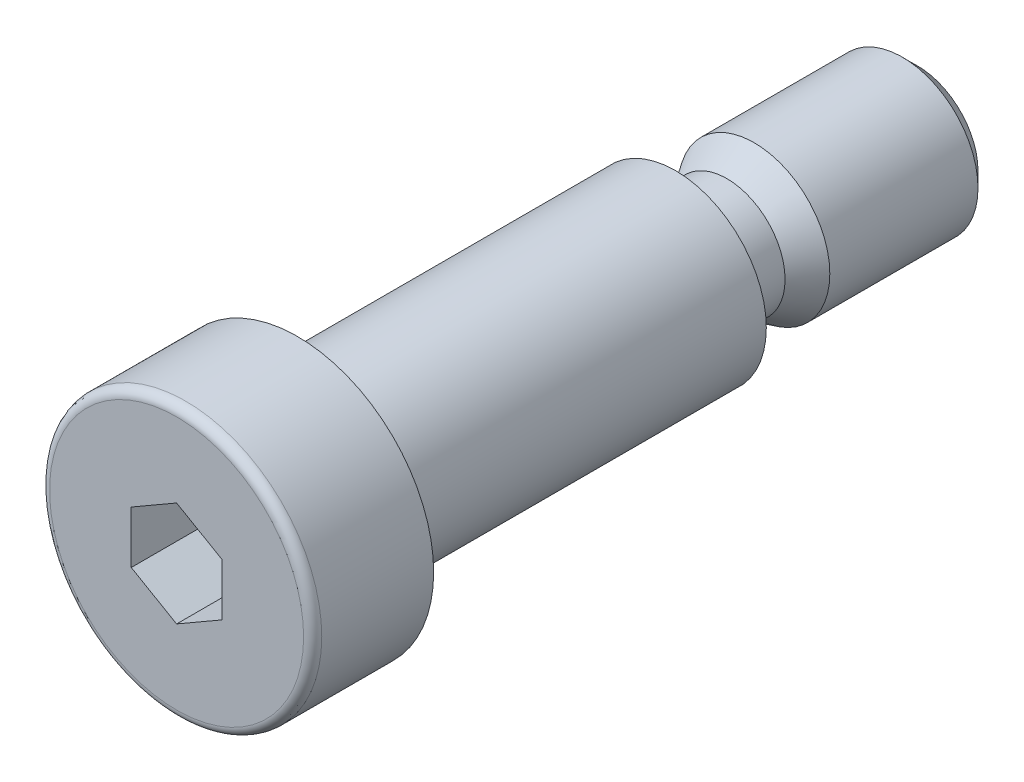
ISO-10303-21;
HEADER;
FILE_DESCRIPTION(('STEP AP214'),'2;1');
FILE_NAME('part.step','',(''),(''),'','','');
FILE_SCHEMA(('AUTOMOTIVE_DESIGN { 1 0 10303 214 1 1 1 1 }'));
ENDSEC;
DATA;
#1=APPLICATION_CONTEXT('core data for automotive mechanical design processes');
#2=APPLICATION_PROTOCOL_DEFINITION('international standard','automotive_design',2000,#1);
#3=PRODUCT_CONTEXT('',#1,'mechanical');
#4=PRODUCT('Part','Part','',(#3));
#5=PRODUCT_RELATED_PRODUCT_CATEGORY('part','',(#4));
#6=PRODUCT_DEFINITION_FORMATION('','',#4);
#7=PRODUCT_DEFINITION_CONTEXT('part definition',#1,'design');
#8=PRODUCT_DEFINITION('design','',#6,#7);
#9=PRODUCT_DEFINITION_SHAPE('','',#8);
#10=(LENGTH_UNIT() NAMED_UNIT(*) SI_UNIT(.MILLI.,.METRE.));
#11=(NAMED_UNIT(*) PLANE_ANGLE_UNIT() SI_UNIT($,.RADIAN.));
#12=(NAMED_UNIT(*) SI_UNIT($,.STERADIAN.) SOLID_ANGLE_UNIT());
#13=UNCERTAINTY_MEASURE_WITH_UNIT(LENGTH_MEASURE(1.E-05),#10,'distance_accuracy_value','');
#14=(GEOMETRIC_REPRESENTATION_CONTEXT(3) GLOBAL_UNCERTAINTY_ASSIGNED_CONTEXT((#13)) GLOBAL_UNIT_ASSIGNED_CONTEXT((#10,
#11,#12)) REPRESENTATION_CONTEXT('',''));
#15=CARTESIAN_POINT('',(0.,0.,0.));
#16=DIRECTION('',(0.,0.,1.));
#17=DIRECTION('',(1.,0.,0.));
#18=AXIS2_PLACEMENT_3D('',#15,#16,#17);
#19=CARTESIAN_POINT('',(0.,0.,20.5));
#20=DIRECTION('',(0.,0.,1.));
#21=DIRECTION('',(1.,0.,0.));
#22=AXIS2_PLACEMENT_3D('',#19,#20,#21);
#23=PLANE('',#22);
#24=CARTESIAN_POINT('',(0.,0.,20.5));
#25=DIRECTION('',(0.,0.,1.));
#26=DIRECTION('',(1.,0.,0.));
#27=AXIS2_PLACEMENT_3D('',#24,#25,#26);
#28=CIRCLE('',#27,8.4);
#29=CARTESIAN_POINT('',(8.4,0.,20.5));
#30=VERTEX_POINT('',#29);
#31=EDGE_CURVE('E42',#30,#30,#28,.T.);
#32=ORIENTED_EDGE('',*,*,#31,.T.);
#33=EDGE_LOOP('',(#32));
#34=FACE_BOUND('',#33,.T.);
#35=DIRECTION('',(0.,1.,0.));
#36=VECTOR('',#35,1.);
#37=CARTESIAN_POINT('',(3.,-1.73205080756888,20.5));
#38=LINE('',#37,#36);
#39=CARTESIAN_POINT('',(3.,-1.73205080756888,20.5));
#40=VERTEX_POINT('',#39);
#41=CARTESIAN_POINT('',(3.,1.73205080756888,20.5));
#42=VERTEX_POINT('',#41);
#43=EDGE_CURVE('E49',#40,#42,#38,.T.);
#44=ORIENTED_EDGE('',*,*,#43,.F.);
#45=DIRECTION('',(0.866025403784439,0.5,0.));
#46=VECTOR('',#45,1.);
#47=CARTESIAN_POINT('',(0.,-3.46410161513775,20.5));
#48=LINE('',#47,#46);
#49=CARTESIAN_POINT('',(0.,-3.46410161513775,20.5));
#50=VERTEX_POINT('',#49);
#51=EDGE_CURVE('E132',#50,#40,#48,.T.);
#52=ORIENTED_EDGE('',*,*,#51,.F.);
#53=DIRECTION('',(0.866025403784439,-0.5,0.));
#54=VECTOR('',#53,1.);
#55=CARTESIAN_POINT('',(-3.,-1.73205080756888,20.5));
#56=LINE('',#55,#54);
#57=CARTESIAN_POINT('',(-3.,-1.73205080756888,20.5));
#58=VERTEX_POINT('',#57);
#59=EDGE_CURVE('E130',#58,#50,#56,.T.);
#60=ORIENTED_EDGE('',*,*,#59,.F.);
#61=DIRECTION('',(0.,-1.,0.));
#62=VECTOR('',#61,1.);
#63=CARTESIAN_POINT('',(-3.,1.73205080756888,20.5));
#64=LINE('',#63,#62);
#65=CARTESIAN_POINT('',(-3.,1.73205080756888,20.5));
#66=VERTEX_POINT('',#65);
#67=EDGE_CURVE('E97',#66,#58,#64,.T.);
#68=ORIENTED_EDGE('',*,*,#67,.F.);
#69=DIRECTION('',(-0.866025403784439,-0.5,0.));
#70=VECTOR('',#69,1.);
#71=CARTESIAN_POINT('',(0.,3.46410161513775,20.5));
#72=LINE('',#71,#70);
#73=CARTESIAN_POINT('',(0.,3.46410161513775,20.5));
#74=VERTEX_POINT('',#73);
#75=EDGE_CURVE('E126',#74,#66,#72,.T.);
#76=ORIENTED_EDGE('',*,*,#75,.F.);
#77=DIRECTION('',(-0.866025403784439,0.5,0.));
#78=VECTOR('',#77,1.);
#79=CARTESIAN_POINT('',(3.,1.73205080756888,20.5));
#80=LINE('',#79,#78);
#81=EDGE_CURVE('E123',#42,#74,#80,.T.);
#82=ORIENTED_EDGE('',*,*,#81,.F.);
#83=EDGE_LOOP('',(#44,#52,#60,#68,#76,#82));
#84=FACE_BOUND('',#83,.T.);
#85=ADVANCED_FACE('F34',(#34,#84),#23,.T.);
#86=CARTESIAN_POINT('',(0.,0.,-28.5));
#87=DIRECTION('',(0.,0.,1.));
#88=DIRECTION('',(1.,0.,0.));
#89=AXIS2_PLACEMENT_3D('',#86,#87,#88);
#90=PLANE('',#89);
#91=CARTESIAN_POINT('',(0.,0.,-28.5));
#92=DIRECTION('',(0.,0.,1.));
#93=DIRECTION('',(1.,0.,0.));
#94=AXIS2_PLACEMENT_3D('',#91,#92,#93);
#95=CIRCLE('',#94,4.);
#96=CARTESIAN_POINT('',(4.,0.,-28.5));
#97=VERTEX_POINT('',#96);
#98=EDGE_CURVE('E162',#97,#97,#95,.T.);
#99=ORIENTED_EDGE('',*,*,#98,.F.);
#100=EDGE_LOOP('',(#99));
#101=FACE_BOUND('',#100,.T.);
#102=ADVANCED_FACE('F178',(#101),#90,.F.);
#103=CARTESIAN_POINT('',(0.,0.,-28.5));
#104=DIRECTION('',(0.,0.,1.));
#105=DIRECTION('',(1.,0.,0.));
#106=AXIS2_PLACEMENT_3D('',#103,#104,#105);
#107=CONICAL_SURFACE('',#106,4.,0.785398163397452);
#108=CARTESIAN_POINT('',(0.,0.,-27.5));
#109=DIRECTION('',(0.,0.,1.));
#110=DIRECTION('',(1.,0.,0.));
#111=AXIS2_PLACEMENT_3D('',#108,#109,#110);
#112=CIRCLE('',#111,5.);
#113=CARTESIAN_POINT('',(5.,0.,-27.5));
#114=VERTEX_POINT('',#113);
#115=EDGE_CURVE('E159',#114,#114,#112,.T.);
#116=ORIENTED_EDGE('',*,*,#115,.F.);
#117=EDGE_LOOP('',(#116));
#118=FACE_BOUND('',#117,.T.);
#119=ORIENTED_EDGE('',*,*,#98,.T.);
#120=EDGE_LOOP('',(#119));
#121=FACE_BOUND('',#120,.T.);
#122=ADVANCED_FACE('F182',(#118,#121),#107,.T.);
#123=CARTESIAN_POINT('',(0.,0.,20.5));
#124=DIRECTION('',(0.,0.,1.));
#125=DIRECTION('',(1.,0.,0.));
#126=AXIS2_PLACEMENT_3D('',#123,#124,#125);
#127=CYLINDRICAL_SURFACE('',#126,5.);
#128=CARTESIAN_POINT('',(0.,0.,-17.7));
#129=DIRECTION('',(0.,0.,1.));
#130=DIRECTION('',(1.,0.,0.));
#131=AXIS2_PLACEMENT_3D('',#128,#129,#130);
#132=CIRCLE('',#131,5.);
#133=CARTESIAN_POINT('',(5.,0.,-17.7));
#134=VERTEX_POINT('',#133);
#135=EDGE_CURVE('E156',#134,#134,#132,.T.);
#136=ORIENTED_EDGE('',*,*,#135,.F.);
#137=EDGE_LOOP('',(#136));
#138=FACE_BOUND('',#137,.T.);
#139=ORIENTED_EDGE('',*,*,#115,.T.);
#140=EDGE_LOOP('',(#139));
#141=FACE_BOUND('',#140,.T.);
#142=ADVANCED_FACE('F188',(#138,#141),#127,.T.);
#143=CARTESIAN_POINT('',(0.,0.,-17.7));
#144=DIRECTION('',(0.,0.,-1.));
#145=DIRECTION('',(-1.,0.,0.));
#146=AXIS2_PLACEMENT_3D('',#143,#144,#145);
#147=CONICAL_SURFACE('',#146,5.,0.566013910063245);
#148=CARTESIAN_POINT('',(0.,0.,-15.89));
#149=DIRECTION('',(0.,0.,1.));
#150=DIRECTION('',(1.,0.,0.));
#151=AXIS2_PLACEMENT_3D('',#148,#149,#150);
#152=CIRCLE('',#151,3.85);
#153=CARTESIAN_POINT('',(3.85,0.,-15.89));
#154=VERTEX_POINT('',#153);
#155=EDGE_CURVE('E153',#154,#154,#152,.T.);
#156=ORIENTED_EDGE('',*,*,#155,.F.);
#157=EDGE_LOOP('',(#156));
#158=FACE_BOUND('',#157,.T.);
#159=ORIENTED_EDGE('',*,*,#135,.T.);
#160=EDGE_LOOP('',(#159));
#161=FACE_BOUND('',#160,.T.);
#162=ADVANCED_FACE('F192',(#158,#161),#147,.T.);
#163=CARTESIAN_POINT('',(0.,0.,20.5));
#164=DIRECTION('',(0.,0.,1.));
#165=DIRECTION('',(1.,0.,0.));
#166=AXIS2_PLACEMENT_3D('',#163,#164,#165);
#167=CYLINDRICAL_SURFACE('',#166,3.85);
#168=ORIENTED_EDGE('',*,*,#155,.T.);
#169=EDGE_LOOP('',(#168));
#170=FACE_BOUND('',#169,.T.);
#171=CARTESIAN_POINT('',(0.,0.,-12.5));
#172=DIRECTION('',(0.,0.,1.));
#173=DIRECTION('',(1.,0.,0.));
#174=AXIS2_PLACEMENT_3D('',#171,#172,#173);
#175=CIRCLE('',#174,3.85);
#176=CARTESIAN_POINT('',(3.85,0.,-12.5));
#177=VERTEX_POINT('',#176);
#178=EDGE_CURVE('E150',#177,#177,#175,.T.);
#179=ORIENTED_EDGE('',*,*,#178,.F.);
#180=EDGE_LOOP('',(#179));
#181=FACE_BOUND('',#180,.T.);
#182=ADVANCED_FACE('F196',(#170,#181),#167,.T.);
#183=CARTESIAN_POINT('',(0.,0.,-12.5));
#184=DIRECTION('',(0.,0.,1.));
#185=DIRECTION('',(1.,0.,0.));
#186=AXIS2_PLACEMENT_3D('',#183,#184,#185);
#187=PLANE('',#186);
#188=CARTESIAN_POINT('',(0.,0.,-12.5));
#189=DIRECTION('',(0.,0.,1.));
#190=DIRECTION('',(1.,0.,0.));
#191=AXIS2_PLACEMENT_3D('',#188,#189,#190);
#192=CIRCLE('',#191,6.);
#193=CARTESIAN_POINT('',(6.,0.,-12.5));
#194=VERTEX_POINT('',#193);
#195=EDGE_CURVE('E147',#194,#194,#192,.T.);
#196=ORIENTED_EDGE('',*,*,#195,.F.);
#197=EDGE_LOOP('',(#196));
#198=FACE_BOUND('',#197,.T.);
#199=ORIENTED_EDGE('',*,*,#178,.T.);
#200=EDGE_LOOP('',(#199));
#201=FACE_BOUND('',#200,.T.);
#202=ADVANCED_FACE('F200',(#198,#201),#187,.F.);
#203=CARTESIAN_POINT('',(0.,0.,20.5));
#204=DIRECTION('',(0.,0.,1.));
#205=DIRECTION('',(1.,0.,0.));
#206=AXIS2_PLACEMENT_3D('',#203,#204,#205);
#207=CYLINDRICAL_SURFACE('',#206,6.);
#208=ORIENTED_EDGE('',*,*,#195,.T.);
#209=EDGE_LOOP('',(#208));
#210=FACE_BOUND('',#209,.T.);
#211=CARTESIAN_POINT('',(0.,0.,12.5));
#212=DIRECTION('',(0.,0.,1.));
#213=DIRECTION('',(1.,0.,0.));
#214=AXIS2_PLACEMENT_3D('',#211,#212,#213);
#215=CIRCLE('',#214,6.);
#216=CARTESIAN_POINT('',(6.,0.,12.5));
#217=VERTEX_POINT('',#216);
#218=EDGE_CURVE('E144',#217,#217,#215,.T.);
#219=ORIENTED_EDGE('',*,*,#218,.F.);
#220=EDGE_LOOP('',(#219));
#221=FACE_BOUND('',#220,.T.);
#222=ADVANCED_FACE('F204',(#210,#221),#207,.T.);
#223=CARTESIAN_POINT('',(0.,0.,12.5));
#224=DIRECTION('',(0.,0.,1.));
#225=DIRECTION('',(1.,0.,0.));
#226=AXIS2_PLACEMENT_3D('',#223,#224,#225);
#227=PLANE('',#226);
#228=CARTESIAN_POINT('',(0.,0.,12.5));
#229=DIRECTION('',(0.,0.,1.));
#230=DIRECTION('',(1.,0.,0.));
#231=AXIS2_PLACEMENT_3D('',#228,#229,#230);
#232=CIRCLE('',#231,9.);
#233=CARTESIAN_POINT('',(9.,0.,12.5));
#234=VERTEX_POINT('',#233);
#235=EDGE_CURVE('E136',#234,#234,#232,.T.);
#236=ORIENTED_EDGE('',*,*,#235,.F.);
#237=EDGE_LOOP('',(#236));
#238=FACE_BOUND('',#237,.T.);
#239=ORIENTED_EDGE('',*,*,#218,.T.);
#240=EDGE_LOOP('',(#239));
#241=FACE_BOUND('',#240,.T.);
#242=ADVANCED_FACE('F208',(#238,#241),#227,.F.);
#243=CARTESIAN_POINT('',(0.,0.,20.5));
#244=DIRECTION('',(0.,0.,1.));
#245=DIRECTION('',(1.,0.,0.));
#246=AXIS2_PLACEMENT_3D('',#243,#244,#245);
#247=CYLINDRICAL_SURFACE('',#246,9.);
#248=CARTESIAN_POINT('',(0.,0.,19.9));
#249=DIRECTION('',(0.,0.,1.));
#250=DIRECTION('',(1.,0.,0.));
#251=AXIS2_PLACEMENT_3D('',#248,#249,#250);
#252=CIRCLE('',#251,9.);
#253=CARTESIAN_POINT('',(9.,0.,19.9));
#254=VERTEX_POINT('',#253);
#255=EDGE_CURVE('E11',#254,#254,#252,.F.);
#256=ORIENTED_EDGE('',*,*,#255,.T.);
#257=EDGE_LOOP('',(#256));
#258=FACE_BOUND('',#257,.T.);
#259=ORIENTED_EDGE('',*,*,#235,.T.);
#260=EDGE_LOOP('',(#259));
#261=FACE_BOUND('',#260,.T.);
#262=ADVANCED_FACE('F212',(#258,#261),#247,.T.);
#263=CARTESIAN_POINT('',(3.,-1.73205080756888,15.6));
#264=DIRECTION('',(1.,0.,0.));
#265=DIRECTION('',(0.,1.,0.));
#266=AXIS2_PLACEMENT_3D('',#263,#264,#265);
#267=PLANE('',#266);
#268=ORIENTED_EDGE('',*,*,#43,.T.);
#269=DIRECTION('',(0.,0.,1.));
#270=VECTOR('',#269,1.);
#271=CARTESIAN_POINT('',(3.,1.73205080756888,15.6));
#272=LINE('',#271,#270);
#273=CARTESIAN_POINT('',(3.,1.73205080756888,15.6));
#274=VERTEX_POINT('',#273);
#275=EDGE_CURVE('E79',#274,#42,#272,.T.);
#276=ORIENTED_EDGE('',*,*,#275,.F.);
#277=DIRECTION('',(0.,1.,0.));
#278=VECTOR('',#277,1.);
#279=CARTESIAN_POINT('',(3.,-1.73205080756888,15.6));
#280=LINE('',#279,#278);
#281=CARTESIAN_POINT('',(3.,-1.73205080756888,15.6));
#282=VERTEX_POINT('',#281);
#283=EDGE_CURVE('E134',#282,#274,#280,.T.);
#284=ORIENTED_EDGE('',*,*,#283,.F.);
#285=DIRECTION('',(0.,0.,1.));
#286=VECTOR('',#285,1.);
#287=CARTESIAN_POINT('',(3.,-1.73205080756888,15.6));
#288=LINE('',#287,#286);
#289=EDGE_CURVE('E57',#282,#40,#288,.T.);
#290=ORIENTED_EDGE('',*,*,#289,.T.);
#291=EDGE_LOOP('',(#268,#276,#284,#290));
#292=FACE_BOUND('',#291,.T.);
#293=ADVANCED_FACE('F216',(#292),#267,.F.);
#294=CARTESIAN_POINT('',(0.,-3.46410161513775,15.6));
#295=DIRECTION('',(0.5,-0.866025403784439,0.));
#296=DIRECTION('',(0.866025403784439,0.5,0.));
#297=AXIS2_PLACEMENT_3D('',#294,#295,#296);
#298=PLANE('',#297);
#299=ORIENTED_EDGE('',*,*,#51,.T.);
#300=ORIENTED_EDGE('',*,*,#289,.F.);
#301=DIRECTION('',(0.866025403784439,0.5,0.));
#302=VECTOR('',#301,1.);
#303=CARTESIAN_POINT('',(0.,-3.46410161513775,15.6));
#304=LINE('',#303,#302);
#305=CARTESIAN_POINT('',(0.,-3.46410161513775,15.6));
#306=VERTEX_POINT('',#305);
#307=EDGE_CURVE('E109',#306,#282,#304,.T.);
#308=ORIENTED_EDGE('',*,*,#307,.F.);
#309=DIRECTION('',(0.,0.,1.));
#310=VECTOR('',#309,1.);
#311=CARTESIAN_POINT('',(0.,-3.46410161513775,15.6));
#312=LINE('',#311,#310);
#313=EDGE_CURVE('E101',#306,#50,#312,.T.);
#314=ORIENTED_EDGE('',*,*,#313,.T.);
#315=EDGE_LOOP('',(#299,#300,#308,#314));
#316=FACE_BOUND('',#315,.T.);
#317=ADVANCED_FACE('F220',(#316),#298,.F.);
#318=CARTESIAN_POINT('',(-3.,-1.73205080756888,15.6));
#319=DIRECTION('',(-0.5,-0.866025403784439,0.));
#320=DIRECTION('',(0.866025403784439,-0.5,0.));
#321=AXIS2_PLACEMENT_3D('',#318,#319,#320);
#322=PLANE('',#321);
#323=ORIENTED_EDGE('',*,*,#59,.T.);
#324=ORIENTED_EDGE('',*,*,#313,.F.);
#325=DIRECTION('',(0.866025403784439,-0.5,0.));
#326=VECTOR('',#325,1.);
#327=CARTESIAN_POINT('',(-3.,-1.73205080756888,15.6));
#328=LINE('',#327,#326);
#329=CARTESIAN_POINT('',(-3.,-1.73205080756888,15.6));
#330=VERTEX_POINT('',#329);
#331=EDGE_CURVE('E105',#330,#306,#328,.T.);
#332=ORIENTED_EDGE('',*,*,#331,.F.);
#333=DIRECTION('',(0.,0.,1.));
#334=VECTOR('',#333,1.);
#335=CARTESIAN_POINT('',(-3.,-1.73205080756888,15.6));
#336=LINE('',#335,#334);
#337=EDGE_CURVE('E90',#330,#58,#336,.T.);
#338=ORIENTED_EDGE('',*,*,#337,.T.);
#339=EDGE_LOOP('',(#323,#324,#332,#338));
#340=FACE_BOUND('',#339,.T.);
#341=ADVANCED_FACE('F106',(#340),#322,.F.);
#342=CARTESIAN_POINT('',(-3.,1.73205080756888,15.6));
#343=DIRECTION('',(-1.,0.,0.));
#344=DIRECTION('',(0.,0.,1.));
#345=AXIS2_PLACEMENT_3D('',#342,#343,#344);
#346=PLANE('',#345);
#347=ORIENTED_EDGE('',*,*,#67,.T.);
#348=ORIENTED_EDGE('',*,*,#337,.F.);
#349=DIRECTION('',(0.,-1.,0.));
#350=VECTOR('',#349,1.);
#351=CARTESIAN_POINT('',(-3.,1.73205080756888,15.6));
#352=LINE('',#351,#350);
#353=CARTESIAN_POINT('',(-3.,1.73205080756888,15.6));
#354=VERTEX_POINT('',#353);
#355=EDGE_CURVE('E94',#354,#330,#352,.T.);
#356=ORIENTED_EDGE('',*,*,#355,.F.);
#357=DIRECTION('',(0.,0.,1.));
#358=VECTOR('',#357,1.);
#359=CARTESIAN_POINT('',(-3.,1.73205080756888,15.6));
#360=LINE('',#359,#358);
#361=EDGE_CURVE('E102',#354,#66,#360,.T.);
#362=ORIENTED_EDGE('',*,*,#361,.T.);
#363=EDGE_LOOP('',(#347,#348,#356,#362));
#364=FACE_BOUND('',#363,.T.);
#365=ADVANCED_FACE('F92',(#364),#346,.F.);
#366=CARTESIAN_POINT('',(0.,3.46410161513775,15.6));
#367=DIRECTION('',(-0.5,0.866025403784439,0.));
#368=DIRECTION('',(-0.866025403784439,-0.5,0.));
#369=AXIS2_PLACEMENT_3D('',#366,#367,#368);
#370=PLANE('',#369);
#371=ORIENTED_EDGE('',*,*,#75,.T.);
#372=ORIENTED_EDGE('',*,*,#361,.F.);
#373=DIRECTION('',(-0.866025403784439,-0.5,0.));
#374=VECTOR('',#373,1.);
#375=CARTESIAN_POINT('',(0.,3.46410161513775,15.6));
#376=LINE('',#375,#374);
#377=CARTESIAN_POINT('',(0.,3.46410161513775,15.6));
#378=VERTEX_POINT('',#377);
#379=EDGE_CURVE('E115',#378,#354,#376,.T.);
#380=ORIENTED_EDGE('',*,*,#379,.F.);
#381=DIRECTION('',(0.,0.,1.));
#382=VECTOR('',#381,1.);
#383=CARTESIAN_POINT('',(0.,3.46410161513775,15.6));
#384=LINE('',#383,#382);
#385=EDGE_CURVE('E139',#378,#74,#384,.T.);
#386=ORIENTED_EDGE('',*,*,#385,.T.);
#387=EDGE_LOOP('',(#371,#372,#380,#386));
#388=FACE_BOUND('',#387,.T.);
#389=ADVANCED_FACE('F223',(#388),#370,.F.);
#390=CARTESIAN_POINT('',(3.,1.73205080756888,15.6));
#391=DIRECTION('',(0.5,0.866025403784439,0.));
#392=DIRECTION('',(-0.866025403784439,0.5,0.));
#393=AXIS2_PLACEMENT_3D('',#390,#391,#392);
#394=PLANE('',#393);
#395=ORIENTED_EDGE('',*,*,#81,.T.);
#396=ORIENTED_EDGE('',*,*,#385,.F.);
#397=DIRECTION('',(-0.866025403784439,0.5,0.));
#398=VECTOR('',#397,1.);
#399=CARTESIAN_POINT('',(3.,1.73205080756888,15.6));
#400=LINE('',#399,#398);
#401=EDGE_CURVE('E117',#274,#378,#400,.T.);
#402=ORIENTED_EDGE('',*,*,#401,.F.);
#403=ORIENTED_EDGE('',*,*,#275,.T.);
#404=EDGE_LOOP('',(#395,#396,#402,#403));
#405=FACE_BOUND('',#404,.T.);
#406=ADVANCED_FACE('F174',(#405),#394,.F.);
#407=CARTESIAN_POINT('',(0.,0.,15.6));
#408=DIRECTION('',(0.,0.,1.));
#409=DIRECTION('',(1.,0.,0.));
#410=AXIS2_PLACEMENT_3D('',#407,#408,#409);
#411=PLANE('',#410);
#412=ORIENTED_EDGE('',*,*,#283,.T.);
#413=ORIENTED_EDGE('',*,*,#401,.T.);
#414=ORIENTED_EDGE('',*,*,#379,.T.);
#415=ORIENTED_EDGE('',*,*,#355,.T.);
#416=ORIENTED_EDGE('',*,*,#331,.T.);
#417=ORIENTED_EDGE('',*,*,#307,.T.);
#418=EDGE_LOOP('',(#412,#413,#414,#415,#416,#417));
#419=FACE_BOUND('',#418,.T.);
#420=ADVANCED_FACE('F112',(#419),#411,.T.);
#421=CARTESIAN_POINT('',(0.,0.,19.9));
#422=DIRECTION('',(0.,0.,1.));
#423=DIRECTION('',(1.,0.,0.));
#424=AXIS2_PLACEMENT_3D('',#421,#422,#423);
#425=TOROIDAL_SURFACE('',#424,8.4,0.6);
#426=ORIENTED_EDGE('',*,*,#255,.F.);
#427=EDGE_LOOP('',(#426));
#428=FACE_BOUND('',#427,.T.);
#429=ORIENTED_EDGE('',*,*,#31,.F.);
#430=EDGE_LOOP('',(#429));
#431=FACE_BOUND('',#430,.T.);
#432=ADVANCED_FACE('F36',(#428,#431),#425,.T.);
#433=CLOSED_SHELL('',(#85,#102,#122,#142,#162,#182,#202,#222,#242,#262,#293,#317,#341,#365,#389,
#406,#420,#432));
#434=MANIFOLD_SOLID_BREP('B2',#433);
#435=ADVANCED_BREP_SHAPE_REPRESENTATION('',(#18,#434),#14);
#436=SHAPE_DEFINITION_REPRESENTATION(#9,#435);
ENDSEC;
END-ISO-10303-21;
